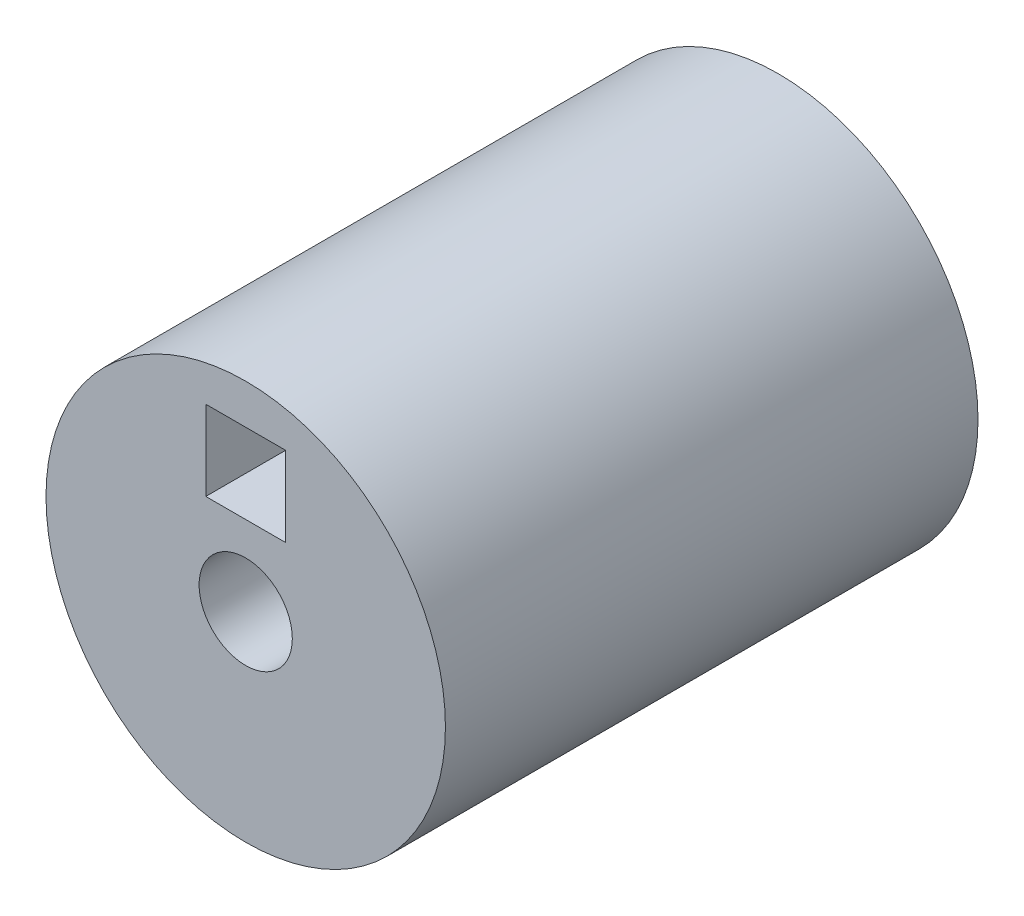
ISO-10303-21;
HEADER;
FILE_DESCRIPTION(('STEP AP214'),'2;1');
FILE_NAME('part.step','',(''),(''),'','','');
FILE_SCHEMA(('AUTOMOTIVE_DESIGN { 1 0 10303 214 1 1 1 1 }'));
ENDSEC;
DATA;
#1=APPLICATION_CONTEXT('core data for automotive mechanical design processes');
#2=APPLICATION_PROTOCOL_DEFINITION('international standard','automotive_design',2000,#1);
#3=PRODUCT_CONTEXT('',#1,'mechanical');
#4=PRODUCT('Part','Part','',(#3));
#5=PRODUCT_RELATED_PRODUCT_CATEGORY('part','',(#4));
#6=PRODUCT_DEFINITION_FORMATION('','',#4);
#7=PRODUCT_DEFINITION_CONTEXT('part definition',#1,'design');
#8=PRODUCT_DEFINITION('design','',#6,#7);
#9=PRODUCT_DEFINITION_SHAPE('','',#8);
#10=(LENGTH_UNIT() NAMED_UNIT(*) SI_UNIT(.MILLI.,.METRE.));
#11=(NAMED_UNIT(*) PLANE_ANGLE_UNIT() SI_UNIT($,.RADIAN.));
#12=(NAMED_UNIT(*) SI_UNIT($,.STERADIAN.) SOLID_ANGLE_UNIT());
#13=UNCERTAINTY_MEASURE_WITH_UNIT(LENGTH_MEASURE(1.E-05),#10,'distance_accuracy_value','');
#14=(GEOMETRIC_REPRESENTATION_CONTEXT(3) GLOBAL_UNCERTAINTY_ASSIGNED_CONTEXT((#13)) GLOBAL_UNIT_ASSIGNED_CONTEXT((#10,
#11,#12)) REPRESENTATION_CONTEXT('',''));
#15=CARTESIAN_POINT('',(0.,0.,0.));
#16=DIRECTION('',(0.,0.,1.));
#17=DIRECTION('',(1.,0.,0.));
#18=AXIS2_PLACEMENT_3D('',#15,#16,#17);
#19=CARTESIAN_POINT('',(0.,0.,20.));
#20=DIRECTION('',(0.,0.,1.));
#21=DIRECTION('',(1.,0.,0.));
#22=AXIS2_PLACEMENT_3D('',#19,#20,#21);
#23=PLANE('',#22);
#24=DIRECTION('',(0.,1.,0.));
#25=VECTOR('',#24,1.);
#26=CARTESIAN_POINT('',(1.5,3.,20.));
#27=LINE('',#26,#25);
#28=CARTESIAN_POINT('',(1.5,3.,20.));
#29=VERTEX_POINT('',#28);
#30=CARTESIAN_POINT('',(1.5,6.,20.));
#31=VERTEX_POINT('',#30);
#32=EDGE_CURVE('E62',#29,#31,#27,.T.);
#33=ORIENTED_EDGE('',*,*,#32,.F.);
#34=DIRECTION('',(1.,0.,0.));
#35=VECTOR('',#34,1.);
#36=CARTESIAN_POINT('',(-1.5,3.,20.));
#37=LINE('',#36,#35);
#38=CARTESIAN_POINT('',(-1.5,3.,20.));
#39=VERTEX_POINT('',#38);
#40=EDGE_CURVE('E146',#39,#29,#37,.T.);
#41=ORIENTED_EDGE('',*,*,#40,.F.);
#42=DIRECTION('',(0.,-1.,0.));
#43=VECTOR('',#42,1.);
#44=CARTESIAN_POINT('',(-1.5,3.,20.));
#45=LINE('',#44,#43);
#46=CARTESIAN_POINT('',(-1.5,6.,20.));
#47=VERTEX_POINT('',#46);
#48=EDGE_CURVE('E160',#47,#39,#45,.T.);
#49=ORIENTED_EDGE('',*,*,#48,.F.);
#50=DIRECTION('',(-1.,0.,0.));
#51=VECTOR('',#50,1.);
#52=CARTESIAN_POINT('',(-1.5,6.,20.));
#53=LINE('',#52,#51);
#54=EDGE_CURVE('E157',#31,#47,#53,.T.);
#55=ORIENTED_EDGE('',*,*,#54,.F.);
#56=EDGE_LOOP('',(#33,#41,#49,#55));
#57=FACE_BOUND('',#56,.T.);
#58=CARTESIAN_POINT('',(0.,0.,20.));
#59=DIRECTION('',(0.,0.,1.));
#60=DIRECTION('',(1.,0.,0.));
#61=AXIS2_PLACEMENT_3D('',#58,#59,#60);
#62=CIRCLE('',#61,7.5);
#63=CARTESIAN_POINT('',(7.5,0.,20.));
#64=VERTEX_POINT('',#63);
#65=EDGE_CURVE('E11',#64,#64,#62,.T.);
#66=ORIENTED_EDGE('',*,*,#65,.T.);
#67=EDGE_LOOP('',(#66));
#68=FACE_BOUND('',#67,.T.);
#69=CARTESIAN_POINT('',(0.,0.,20.));
#70=DIRECTION('',(0.,0.,1.));
#71=DIRECTION('',(1.,0.,0.));
#72=AXIS2_PLACEMENT_3D('',#69,#70,#71);
#73=CIRCLE('',#72,1.75);
#74=CARTESIAN_POINT('',(1.75,0.,20.));
#75=VERTEX_POINT('',#74);
#76=EDGE_CURVE('E173',#75,#75,#73,.T.);
#77=ORIENTED_EDGE('',*,*,#76,.F.);
#78=EDGE_LOOP('',(#77));
#79=FACE_BOUND('',#78,.T.);
#80=ADVANCED_FACE('F39',(#57,#68,#79),#23,.T.);
#81=CARTESIAN_POINT('',(0.,0.,0.));
#82=DIRECTION('',(0.,0.,1.));
#83=DIRECTION('',(1.,0.,0.));
#84=AXIS2_PLACEMENT_3D('',#81,#82,#83);
#85=PLANE('',#84);
#86=DIRECTION('',(0.951056516295154,0.309016994374948,0.));
#87=VECTOR('',#86,1.);
#88=CARTESIAN_POINT('',(-0.427517191806958,6.16986458933334,0.));
#89=LINE('',#88,#87);
#90=CARTESIAN_POINT('',(-3.28068674069242,5.2428136062085,0.));
#91=VERTEX_POINT('',#90);
#92=CARTESIAN_POINT('',(-0.427517191806958,6.16986458933334,0.));
#93=VERTEX_POINT('',#92);
#94=EDGE_CURVE('E133',#91,#93,#89,.T.);
#95=ORIENTED_EDGE('',*,*,#94,.F.);
#96=DIRECTION('',(-0.309016994374948,0.951056516295154,0.));
#97=VECTOR('',#96,1.);
#98=CARTESIAN_POINT('',(-3.28068674069242,5.2428136062085,0.));
#99=LINE('',#98,#97);
#100=CARTESIAN_POINT('',(-2.35363575756757,2.38964405732304,0.));
#101=VERTEX_POINT('',#100);
#102=EDGE_CURVE('E54',#101,#91,#99,.T.);
#103=ORIENTED_EDGE('',*,*,#102,.F.);
#104=DIRECTION('',(-0.951056516295154,-0.309016994374948,0.));
#105=VECTOR('',#104,1.);
#106=CARTESIAN_POINT('',(-2.35363575756757,2.38964405732304,0.));
#107=LINE('',#106,#105);
#108=CARTESIAN_POINT('',(0.499533791317886,3.31669504044788,0.));
#109=VERTEX_POINT('',#108);
#110=EDGE_CURVE('E124',#109,#101,#107,.T.);
#111=ORIENTED_EDGE('',*,*,#110,.F.);
#112=DIRECTION('',(0.309016994374948,-0.951056516295153,0.));
#113=VECTOR('',#112,1.);
#114=CARTESIAN_POINT('',(0.499533791317886,3.31669504044788,0.));
#115=LINE('',#114,#113);
#116=EDGE_CURVE('E127',#93,#109,#115,.T.);
#117=ORIENTED_EDGE('',*,*,#116,.F.);
#118=EDGE_LOOP('',(#95,#103,#111,#117));
#119=FACE_BOUND('',#118,.T.);
#120=CARTESIAN_POINT('',(0.,0.,0.));
#121=DIRECTION('',(0.,0.,1.));
#122=DIRECTION('',(1.,0.,0.));
#123=AXIS2_PLACEMENT_3D('',#120,#121,#122);
#124=CIRCLE('',#123,7.5);
#125=CARTESIAN_POINT('',(7.5,0.,0.));
#126=VERTEX_POINT('',#125);
#127=EDGE_CURVE('E43',#126,#126,#124,.T.);
#128=ORIENTED_EDGE('',*,*,#127,.F.);
#129=EDGE_LOOP('',(#128));
#130=FACE_BOUND('',#129,.T.);
#131=CARTESIAN_POINT('',(0.,0.,0.));
#132=DIRECTION('',(0.,0.,1.));
#133=DIRECTION('',(1.,0.,0.));
#134=AXIS2_PLACEMENT_3D('',#131,#132,#133);
#135=CIRCLE('',#134,1.75);
#136=CARTESIAN_POINT('',(1.75,0.,0.));
#137=VERTEX_POINT('',#136);
#138=EDGE_CURVE('E167',#137,#137,#135,.T.);
#139=ORIENTED_EDGE('',*,*,#138,.T.);
#140=EDGE_LOOP('',(#139));
#141=FACE_BOUND('',#140,.T.);
#142=ADVANCED_FACE('F179',(#119,#130,#141),#85,.F.);
#143=CARTESIAN_POINT('',(0.,0.,20.));
#144=DIRECTION('',(0.,0.,-1.));
#145=DIRECTION('',(-1.,0.,0.));
#146=AXIS2_PLACEMENT_3D('',#143,#144,#145);
#147=CYLINDRICAL_SURFACE('',#146,7.5);
#148=ORIENTED_EDGE('',*,*,#65,.F.);
#149=EDGE_LOOP('',(#148));
#150=FACE_BOUND('',#149,.T.);
#151=ORIENTED_EDGE('',*,*,#127,.T.);
#152=EDGE_LOOP('',(#151));
#153=FACE_BOUND('',#152,.T.);
#154=ADVANCED_FACE('F41',(#150,#153),#147,.T.);
#155=CARTESIAN_POINT('',(0.,0.,20.));
#156=DIRECTION('',(0.,0.,-1.));
#157=DIRECTION('',(-1.,0.,0.));
#158=AXIS2_PLACEMENT_3D('',#155,#156,#157);
#159=CYLINDRICAL_SURFACE('',#158,1.75);
#160=ORIENTED_EDGE('',*,*,#76,.T.);
#161=EDGE_LOOP('',(#160));
#162=FACE_BOUND('',#161,.T.);
#163=ORIENTED_EDGE('',*,*,#138,.F.);
#164=EDGE_LOOP('',(#163));
#165=FACE_BOUND('',#164,.T.);
#166=ADVANCED_FACE('F181',(#162,#165),#159,.F.);
#167=CARTESIAN_POINT('',(1.5,3.,12.));
#168=DIRECTION('',(1.,0.,0.));
#169=DIRECTION('',(0.,0.,-1.));
#170=AXIS2_PLACEMENT_3D('',#167,#168,#169);
#171=PLANE('',#170);
#172=ORIENTED_EDGE('',*,*,#32,.T.);
#173=DIRECTION('',(0.,0.,1.));
#174=VECTOR('',#173,1.);
#175=CARTESIAN_POINT('',(1.5,6.,12.));
#176=LINE('',#175,#174);
#177=CARTESIAN_POINT('',(1.5,6.,12.));
#178=VERTEX_POINT('',#177);
#179=EDGE_CURVE('E155',#178,#31,#176,.T.);
#180=ORIENTED_EDGE('',*,*,#179,.F.);
#181=DIRECTION('',(0.,1.,0.));
#182=VECTOR('',#181,1.);
#183=CARTESIAN_POINT('',(1.5,3.,12.));
#184=LINE('',#183,#182);
#185=CARTESIAN_POINT('',(1.5,3.,12.));
#186=VERTEX_POINT('',#185);
#187=EDGE_CURVE('E142',#186,#178,#184,.T.);
#188=ORIENTED_EDGE('',*,*,#187,.F.);
#189=DIRECTION('',(0.,0.,1.));
#190=VECTOR('',#189,1.);
#191=CARTESIAN_POINT('',(1.5,3.,12.));
#192=LINE('',#191,#190);
#193=EDGE_CURVE('E165',#186,#29,#192,.T.);
#194=ORIENTED_EDGE('',*,*,#193,.T.);
#195=EDGE_LOOP('',(#172,#180,#188,#194));
#196=FACE_BOUND('',#195,.T.);
#197=ADVANCED_FACE('F183',(#196),#171,.F.);
#198=CARTESIAN_POINT('',(-1.5,3.,12.));
#199=DIRECTION('',(0.,-1.,0.));
#200=DIRECTION('',(0.,0.,-1.));
#201=AXIS2_PLACEMENT_3D('',#198,#199,#200);
#202=PLANE('',#201);
#203=ORIENTED_EDGE('',*,*,#40,.T.);
#204=ORIENTED_EDGE('',*,*,#193,.F.);
#205=DIRECTION('',(1.,0.,0.));
#206=VECTOR('',#205,1.);
#207=CARTESIAN_POINT('',(-1.5,3.,12.));
#208=LINE('',#207,#206);
#209=CARTESIAN_POINT('',(-1.5,3.,12.));
#210=VERTEX_POINT('',#209);
#211=EDGE_CURVE('E152',#210,#186,#208,.T.);
#212=ORIENTED_EDGE('',*,*,#211,.F.);
#213=DIRECTION('',(0.,0.,1.));
#214=VECTOR('',#213,1.);
#215=CARTESIAN_POINT('',(-1.5,3.,12.));
#216=LINE('',#215,#214);
#217=EDGE_CURVE('E168',#210,#39,#216,.T.);
#218=ORIENTED_EDGE('',*,*,#217,.T.);
#219=EDGE_LOOP('',(#203,#204,#212,#218));
#220=FACE_BOUND('',#219,.T.);
#221=ADVANCED_FACE('F191',(#220),#202,.F.);
#222=CARTESIAN_POINT('',(-1.5,3.,12.));
#223=DIRECTION('',(-1.,0.,0.));
#224=DIRECTION('',(0.,0.,1.));
#225=AXIS2_PLACEMENT_3D('',#222,#223,#224);
#226=PLANE('',#225);
#227=ORIENTED_EDGE('',*,*,#48,.T.);
#228=ORIENTED_EDGE('',*,*,#217,.F.);
#229=DIRECTION('',(0.,-1.,0.));
#230=VECTOR('',#229,1.);
#231=CARTESIAN_POINT('',(-1.5,3.,12.));
#232=LINE('',#231,#230);
#233=CARTESIAN_POINT('',(-1.5,6.,12.));
#234=VERTEX_POINT('',#233);
#235=EDGE_CURVE('E149',#234,#210,#232,.T.);
#236=ORIENTED_EDGE('',*,*,#235,.F.);
#237=DIRECTION('',(0.,0.,1.));
#238=VECTOR('',#237,1.);
#239=CARTESIAN_POINT('',(-1.5,6.,12.));
#240=LINE('',#239,#238);
#241=EDGE_CURVE('E170',#234,#47,#240,.T.);
#242=ORIENTED_EDGE('',*,*,#241,.T.);
#243=EDGE_LOOP('',(#227,#228,#236,#242));
#244=FACE_BOUND('',#243,.T.);
#245=ADVANCED_FACE('F221',(#244),#226,.F.);
#246=CARTESIAN_POINT('',(-1.5,6.,12.));
#247=DIRECTION('',(0.,1.,0.));
#248=DIRECTION('',(0.,0.,1.));
#249=AXIS2_PLACEMENT_3D('',#246,#247,#248);
#250=PLANE('',#249);
#251=ORIENTED_EDGE('',*,*,#54,.T.);
#252=ORIENTED_EDGE('',*,*,#241,.F.);
#253=DIRECTION('',(-1.,0.,0.));
#254=VECTOR('',#253,1.);
#255=CARTESIAN_POINT('',(-1.5,6.,12.));
#256=LINE('',#255,#254);
#257=EDGE_CURVE('E145',#178,#234,#256,.T.);
#258=ORIENTED_EDGE('',*,*,#257,.F.);
#259=ORIENTED_EDGE('',*,*,#179,.T.);
#260=EDGE_LOOP('',(#251,#252,#258,#259));
#261=FACE_BOUND('',#260,.T.);
#262=ADVANCED_FACE('F212',(#261),#250,.F.);
#263=CARTESIAN_POINT('',(0.,0.,12.));
#264=DIRECTION('',(0.,0.,-1.));
#265=DIRECTION('',(-1.,0.,0.));
#266=AXIS2_PLACEMENT_3D('',#263,#264,#265);
#267=PLANE('',#266);
#268=ORIENTED_EDGE('',*,*,#187,.T.);
#269=ORIENTED_EDGE('',*,*,#257,.T.);
#270=ORIENTED_EDGE('',*,*,#235,.T.);
#271=ORIENTED_EDGE('',*,*,#211,.T.);
#272=EDGE_LOOP('',(#268,#269,#270,#271));
#273=FACE_BOUND('',#272,.T.);
#274=ADVANCED_FACE('F218',(#273),#267,.F.);
#275=CARTESIAN_POINT('',(-3.28068674069242,5.2428136062085,8.));
#276=DIRECTION('',(-0.951056516295153,-0.309016994374948,0.));
#277=DIRECTION('',(0.309016994374948,-0.951056516295153,0.));
#278=AXIS2_PLACEMENT_3D('',#275,#276,#277);
#279=PLANE('',#278);
#280=ORIENTED_EDGE('',*,*,#102,.T.);
#281=DIRECTION('',(0.,0.,-1.));
#282=VECTOR('',#281,1.);
#283=CARTESIAN_POINT('',(-3.28068674069242,5.2428136062085,8.));
#284=LINE('',#283,#282);
#285=CARTESIAN_POINT('',(-3.28068674069242,5.2428136062085,8.));
#286=VERTEX_POINT('',#285);
#287=EDGE_CURVE('E102',#286,#91,#284,.T.);
#288=ORIENTED_EDGE('',*,*,#287,.F.);
#289=DIRECTION('',(-0.309016994374948,0.951056516295154,0.));
#290=VECTOR('',#289,1.);
#291=CARTESIAN_POINT('',(-3.28068674069242,5.2428136062085,8.));
#292=LINE('',#291,#290);
#293=CARTESIAN_POINT('',(-2.35363575756757,2.38964405732304,8.));
#294=VERTEX_POINT('',#293);
#295=EDGE_CURVE('E106',#294,#286,#292,.T.);
#296=ORIENTED_EDGE('',*,*,#295,.F.);
#297=DIRECTION('',(0.,0.,-1.));
#298=VECTOR('',#297,1.);
#299=CARTESIAN_POINT('',(-2.35363575756757,2.38964405732304,8.));
#300=LINE('',#299,#298);
#301=EDGE_CURVE('E137',#294,#101,#300,.T.);
#302=ORIENTED_EDGE('',*,*,#301,.T.);
#303=EDGE_LOOP('',(#280,#288,#296,#302));
#304=FACE_BOUND('',#303,.T.);
#305=ADVANCED_FACE('F104',(#304),#279,.F.);
#306=CARTESIAN_POINT('',(-2.35363575756757,2.38964405732304,8.));
#307=DIRECTION('',(0.309016994374948,-0.951056516295154,0.));
#308=DIRECTION('',(0.951056516295154,0.309016994374948,0.));
#309=AXIS2_PLACEMENT_3D('',#306,#307,#308);
#310=PLANE('',#309);
#311=ORIENTED_EDGE('',*,*,#110,.T.);
#312=ORIENTED_EDGE('',*,*,#301,.F.);
#313=DIRECTION('',(-0.951056516295154,-0.309016994374948,0.));
#314=VECTOR('',#313,1.);
#315=CARTESIAN_POINT('',(-2.35363575756757,2.38964405732304,8.));
#316=LINE('',#315,#314);
#317=CARTESIAN_POINT('',(0.499533791317886,3.31669504044788,8.));
#318=VERTEX_POINT('',#317);
#319=EDGE_CURVE('E112',#318,#294,#316,.T.);
#320=ORIENTED_EDGE('',*,*,#319,.F.);
#321=DIRECTION('',(0.,0.,-1.));
#322=VECTOR('',#321,1.);
#323=CARTESIAN_POINT('',(0.499533791317886,3.31669504044788,8.));
#324=LINE('',#323,#322);
#325=EDGE_CURVE('E139',#318,#109,#324,.T.);
#326=ORIENTED_EDGE('',*,*,#325,.T.);
#327=EDGE_LOOP('',(#311,#312,#320,#326));
#328=FACE_BOUND('',#327,.T.);
#329=ADVANCED_FACE('F235',(#328),#310,.F.);
#330=CARTESIAN_POINT('',(0.499533791317886,3.31669504044788,8.));
#331=DIRECTION('',(0.951056516295153,0.309016994374948,0.));
#332=DIRECTION('',(-0.309016994374948,0.951056516295153,0.));
#333=AXIS2_PLACEMENT_3D('',#330,#331,#332);
#334=PLANE('',#333);
#335=ORIENTED_EDGE('',*,*,#116,.T.);
#336=ORIENTED_EDGE('',*,*,#325,.F.);
#337=DIRECTION('',(0.309016994374948,-0.951056516295153,0.));
#338=VECTOR('',#337,1.);
#339=CARTESIAN_POINT('',(0.499533791317886,3.31669504044788,8.));
#340=LINE('',#339,#338);
#341=CARTESIAN_POINT('',(-0.427517191806958,6.16986458933334,8.));
#342=VERTEX_POINT('',#341);
#343=EDGE_CURVE('E120',#342,#318,#340,.T.);
#344=ORIENTED_EDGE('',*,*,#343,.F.);
#345=DIRECTION('',(0.,0.,-1.));
#346=VECTOR('',#345,1.);
#347=CARTESIAN_POINT('',(-0.427517191806958,6.16986458933334,8.));
#348=LINE('',#347,#346);
#349=EDGE_CURVE('E111',#342,#93,#348,.T.);
#350=ORIENTED_EDGE('',*,*,#349,.T.);
#351=EDGE_LOOP('',(#335,#336,#344,#350));
#352=FACE_BOUND('',#351,.T.);
#353=ADVANCED_FACE('F238',(#352),#334,.F.);
#354=CARTESIAN_POINT('',(-0.427517191806958,6.16986458933334,8.));
#355=DIRECTION('',(-0.309016994374948,0.951056516295154,0.));
#356=DIRECTION('',(-0.951056516295154,-0.309016994374948,0.));
#357=AXIS2_PLACEMENT_3D('',#354,#355,#356);
#358=PLANE('',#357);
#359=ORIENTED_EDGE('',*,*,#94,.T.);
#360=ORIENTED_EDGE('',*,*,#349,.F.);
#361=DIRECTION('',(0.951056516295154,0.309016994374948,0.));
#362=VECTOR('',#361,1.);
#363=CARTESIAN_POINT('',(-0.427517191806958,6.16986458933334,8.));
#364=LINE('',#363,#362);
#365=EDGE_CURVE('E115',#286,#342,#364,.T.);
#366=ORIENTED_EDGE('',*,*,#365,.F.);
#367=ORIENTED_EDGE('',*,*,#287,.T.);
#368=EDGE_LOOP('',(#359,#360,#366,#367));
#369=FACE_BOUND('',#368,.T.);
#370=ADVANCED_FACE('F116',(#369),#358,.F.);
#371=CARTESIAN_POINT('',(0.,0.,8.));
#372=DIRECTION('',(0.,0.,1.));
#373=DIRECTION('',(1.,0.,0.));
#374=AXIS2_PLACEMENT_3D('',#371,#372,#373);
#375=PLANE('',#374);
#376=ORIENTED_EDGE('',*,*,#295,.T.);
#377=ORIENTED_EDGE('',*,*,#365,.T.);
#378=ORIENTED_EDGE('',*,*,#343,.T.);
#379=ORIENTED_EDGE('',*,*,#319,.T.);
#380=EDGE_LOOP('',(#376,#377,#378,#379));
#381=FACE_BOUND('',#380,.T.);
#382=ADVANCED_FACE('F122',(#381),#375,.F.);
#383=CLOSED_SHELL('',(#80,#142,#154,#166,#197,#221,#245,#262,#274,#305,#329,#353,#370,#382));
#384=MANIFOLD_SOLID_BREP('B2',#383);
#385=ADVANCED_BREP_SHAPE_REPRESENTATION('',(#18,#384),#14);
#386=SHAPE_DEFINITION_REPRESENTATION(#9,#385);
ENDSEC;
END-ISO-10303-21;
